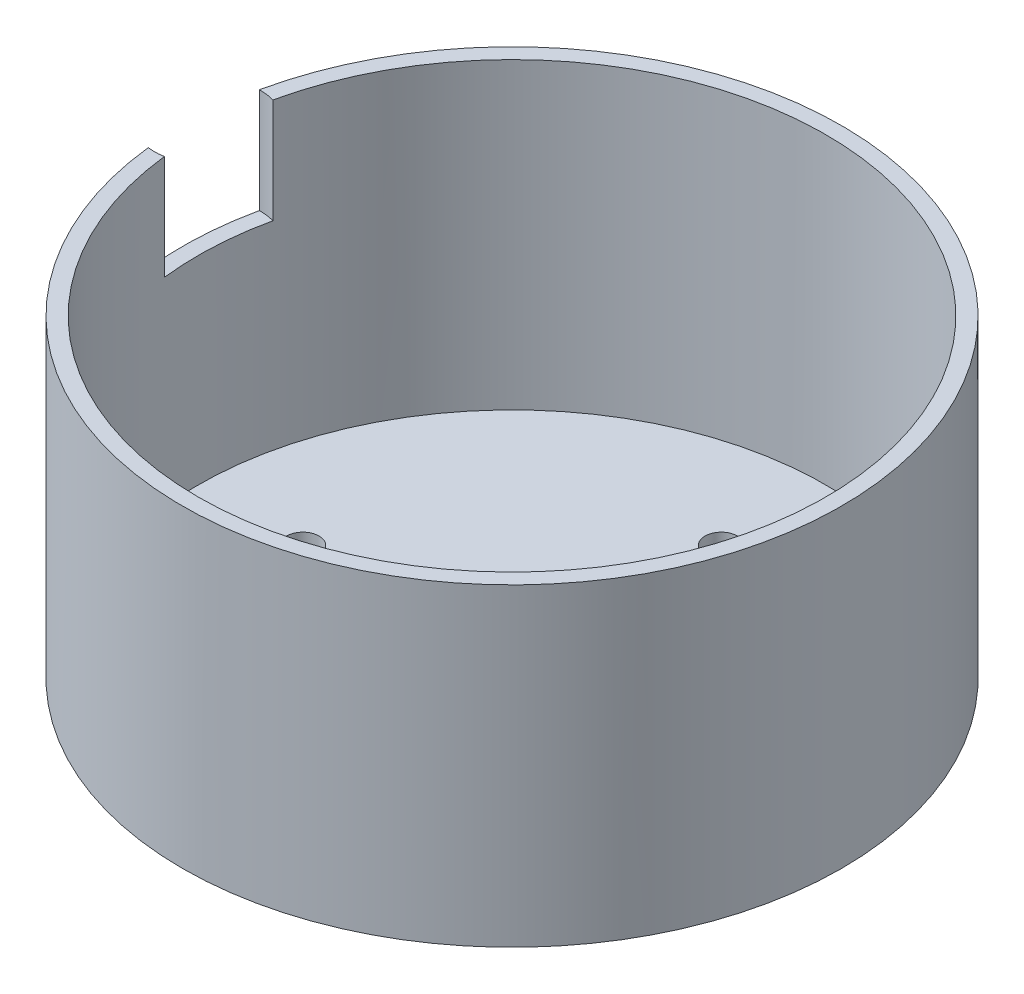
ISO-10303-21;
HEADER;
FILE_DESCRIPTION(('STEP AP214'),'2;1');
FILE_NAME('part.step','',(''),(''),'','','');
FILE_SCHEMA(('AUTOMOTIVE_DESIGN { 1 0 10303 214 1 1 1 1 }'));
ENDSEC;
DATA;
#1=APPLICATION_CONTEXT('core data for automotive mechanical design processes');
#2=APPLICATION_PROTOCOL_DEFINITION('international standard','automotive_design',2000,#1);
#3=PRODUCT_CONTEXT('',#1,'mechanical');
#4=PRODUCT('Part','Part','',(#3));
#5=PRODUCT_RELATED_PRODUCT_CATEGORY('part','',(#4));
#6=PRODUCT_DEFINITION_FORMATION('','',#4);
#7=PRODUCT_DEFINITION_CONTEXT('part definition',#1,'design');
#8=PRODUCT_DEFINITION('design','',#6,#7);
#9=PRODUCT_DEFINITION_SHAPE('','',#8);
#10=(LENGTH_UNIT() NAMED_UNIT(*) SI_UNIT(.MILLI.,.METRE.));
#11=(NAMED_UNIT(*) PLANE_ANGLE_UNIT() SI_UNIT($,.RADIAN.));
#12=(NAMED_UNIT(*) SI_UNIT($,.STERADIAN.) SOLID_ANGLE_UNIT());
#13=UNCERTAINTY_MEASURE_WITH_UNIT(LENGTH_MEASURE(1.E-05),#10,'distance_accuracy_value','');
#14=(GEOMETRIC_REPRESENTATION_CONTEXT(3) GLOBAL_UNCERTAINTY_ASSIGNED_CONTEXT((#13)) GLOBAL_UNIT_ASSIGNED_CONTEXT((#10,
#11,#12)) REPRESENTATION_CONTEXT('',''));
#15=CARTESIAN_POINT('',(0.,0.,0.));
#16=DIRECTION('',(0.,0.,1.));
#17=DIRECTION('',(1.,0.,0.));
#18=AXIS2_PLACEMENT_3D('',#15,#16,#17);
#19=CARTESIAN_POINT('',(0.,30.,0.));
#20=DIRECTION('',(0.,-1.,0.));
#21=DIRECTION('',(0.,0.,-1.));
#22=AXIS2_PLACEMENT_3D('',#19,#20,#21);
#23=CYLINDRICAL_SURFACE('',#22,31.5);
#24=CARTESIAN_POINT('',(0.,0.,0.));
#25=DIRECTION('',(0.,1.,0.));
#26=DIRECTION('',(0.,0.,1.));
#27=AXIS2_PLACEMENT_3D('',#24,#25,#26);
#28=CIRCLE('',#27,31.5);
#29=CARTESIAN_POINT('',(0.,0.,31.5));
#30=VERTEX_POINT('',#29);
#31=EDGE_CURVE('E95',#30,#30,#28,.T.);
#32=ORIENTED_EDGE('',*,*,#31,.T.);
#33=EDGE_LOOP('',(#32));
#34=FACE_BOUND('',#33,.T.);
#35=DIRECTION('',(0.,-1.,0.));
#36=VECTOR('',#35,1.);
#37=CARTESIAN_POINT('',(-30.7927132439752,25.,-6.63768115190193));
#38=LINE('',#37,#36);
#39=CARTESIAN_POINT('',(-30.7927132439752,30.,-6.63768115190193));
#40=VERTEX_POINT('',#39);
#41=CARTESIAN_POINT('',(-30.7927132439752,20.,-6.63768115190193));
#42=VERTEX_POINT('',#41);
#43=EDGE_CURVE('E118',#40,#42,#38,.T.);
#44=ORIENTED_EDGE('',*,*,#43,.F.);
#45=CARTESIAN_POINT('',(0.,30.,0.));
#46=DIRECTION('',(0.,1.,0.));
#47=DIRECTION('',(0.,0.,1.));
#48=AXIS2_PLACEMENT_3D('',#45,#46,#47);
#49=CIRCLE('',#48,31.5);
#50=CARTESIAN_POINT('',(-31.308347944542,30.,3.46948828842145));
#51=VERTEX_POINT('',#50);
#52=EDGE_CURVE('E102',#51,#40,#49,.T.);
#53=ORIENTED_EDGE('',*,*,#52,.F.);
#54=DIRECTION('',(0.,-1.,0.));
#55=VECTOR('',#54,1.);
#56=CARTESIAN_POINT('',(-31.308347944542,25.,3.46948828842145));
#57=LINE('',#56,#55);
#58=CARTESIAN_POINT('',(-31.308347944542,20.,3.46948828842145));
#59=VERTEX_POINT('',#58);
#60=EDGE_CURVE('E76',#59,#51,#57,.F.);
#61=ORIENTED_EDGE('',*,*,#60,.F.);
#62=CARTESIAN_POINT('',(0.,20.,0.));
#63=DIRECTION('',(0.,-1.,0.));
#64=DIRECTION('',(0.,0.,-1.));
#65=AXIS2_PLACEMENT_3D('',#62,#63,#64);
#66=CIRCLE('',#65,31.5);
#67=EDGE_CURVE('E54',#59,#42,#66,.T.);
#68=ORIENTED_EDGE('',*,*,#67,.T.);
#69=EDGE_LOOP('',(#44,#53,#61,#68));
#70=FACE_BOUND('',#69,.T.);
#71=ADVANCED_FACE('F33',(#34,#70),#23,.T.);
#72=CARTESIAN_POINT('',(0.,0.999999999999997,0.));
#73=DIRECTION('',(0.,1.,0.));
#74=DIRECTION('',(0.,0.,1.));
#75=AXIS2_PLACEMENT_3D('',#72,#73,#74);
#76=CYLINDRICAL_SURFACE('',#75,30.);
#77=CARTESIAN_POINT('',(0.,0.999999999999997,0.));
#78=DIRECTION('',(0.,1.,0.));
#79=DIRECTION('',(0.,0.,1.));
#80=AXIS2_PLACEMENT_3D('',#77,#78,#79);
#81=CIRCLE('',#80,30.);
#82=CARTESIAN_POINT('',(0.,0.999999999999997,30.));
#83=VERTEX_POINT('',#82);
#84=EDGE_CURVE('E91',#83,#83,#81,.T.);
#85=ORIENTED_EDGE('',*,*,#84,.F.);
#86=EDGE_LOOP('',(#85));
#87=FACE_BOUND('',#86,.T.);
#88=DIRECTION('',(0.,-1.,0.));
#89=VECTOR('',#88,1.);
#90=CARTESIAN_POINT('',(-29.8034670050977,25.,3.42831656590367));
#91=LINE('',#90,#89);
#92=CARTESIAN_POINT('',(-29.8034670050977,30.,3.42831656590367));
#93=VERTEX_POINT('',#92);
#94=CARTESIAN_POINT('',(-29.8034670050977,20.,3.42831656590367));
#95=VERTEX_POINT('',#94);
#96=EDGE_CURVE('E12',#93,#95,#91,.T.);
#97=ORIENTED_EDGE('',*,*,#96,.F.);
#98=CARTESIAN_POINT('',(0.,30.,0.));
#99=DIRECTION('',(0.,1.,0.));
#100=DIRECTION('',(0.,0.,1.));
#101=AXIS2_PLACEMENT_3D('',#98,#99,#100);
#102=CIRCLE('',#101,30.);
#103=CARTESIAN_POINT('',(-29.2998354833074,30.,-6.44357359321058));
#104=VERTEX_POINT('',#103);
#105=EDGE_CURVE('E88',#93,#104,#102,.T.);
#106=ORIENTED_EDGE('',*,*,#105,.T.);
#107=DIRECTION('',(0.,-1.,0.));
#108=VECTOR('',#107,1.);
#109=CARTESIAN_POINT('',(-29.2998354833074,25.,-6.44357359321058));
#110=LINE('',#109,#108);
#111=CARTESIAN_POINT('',(-29.2998354833074,20.,-6.44357359321058));
#112=VERTEX_POINT('',#111);
#113=EDGE_CURVE('E104',#112,#104,#110,.F.);
#114=ORIENTED_EDGE('',*,*,#113,.F.);
#115=CARTESIAN_POINT('',(0.,20.,0.));
#116=DIRECTION('',(0.,-1.,0.));
#117=DIRECTION('',(0.,0.,-1.));
#118=AXIS2_PLACEMENT_3D('',#115,#116,#117);
#119=CIRCLE('',#118,30.);
#120=EDGE_CURVE('E40',#112,#95,#119,.F.);
#121=ORIENTED_EDGE('',*,*,#120,.T.);
#122=EDGE_LOOP('',(#97,#106,#114,#121));
#123=FACE_BOUND('',#122,.T.);
#124=ADVANCED_FACE('F86',(#87,#123),#76,.F.);
#125=CARTESIAN_POINT('',(0.,30.,0.));
#126=DIRECTION('',(0.,1.,0.));
#127=DIRECTION('',(0.,0.,1.));
#128=AXIS2_PLACEMENT_3D('',#125,#126,#127);
#129=PLANE('',#128);
#130=ORIENTED_EDGE('',*,*,#52,.T.);
#131=CARTESIAN_POINT('',(-30.6931053583526,30.,-1.56586176618134));
#132=DIRECTION('',(0.,1.,0.));
#133=DIRECTION('',(0.,0.,1.));
#134=AXIS2_PLACEMENT_3D('',#131,#132,#133);
#135=CIRCLE('',#134,5.07279741486385);
#136=EDGE_CURVE('E81',#104,#40,#135,.T.);
#137=ORIENTED_EDGE('',*,*,#136,.F.);
#138=ORIENTED_EDGE('',*,*,#105,.F.);
#139=EDGE_CURVE('E72',#51,#93,#135,.T.);
#140=ORIENTED_EDGE('',*,*,#139,.F.);
#141=EDGE_LOOP('',(#130,#137,#138,#140));
#142=FACE_BOUND('',#141,.T.);
#143=ADVANCED_FACE('F90',(#142),#129,.T.);
#144=CARTESIAN_POINT('',(0.,0.,0.));
#145=DIRECTION('',(0.,1.,0.));
#146=DIRECTION('',(0.,0.,1.));
#147=AXIS2_PLACEMENT_3D('',#144,#145,#146);
#148=PLANE('',#147);
#149=CARTESIAN_POINT('',(0.,0.,20.));
#150=DIRECTION('',(0.,-1.,0.));
#151=DIRECTION('',(0.,0.,-1.));
#152=AXIS2_PLACEMENT_3D('',#149,#150,#151);
#153=CIRCLE('',#152,1.55);
#154=CARTESIAN_POINT('',(0.,0.,18.45));
#155=VERTEX_POINT('',#154);
#156=EDGE_CURVE('E111',#155,#155,#153,.T.);
#157=ORIENTED_EDGE('',*,*,#156,.F.);
#158=EDGE_LOOP('',(#157));
#159=FACE_BOUND('',#158,.T.);
#160=CARTESIAN_POINT('',(0.,0.,-20.));
#161=DIRECTION('',(0.,-1.,0.));
#162=DIRECTION('',(0.,0.,-1.));
#163=AXIS2_PLACEMENT_3D('',#160,#161,#162);
#164=CIRCLE('',#163,1.55);
#165=CARTESIAN_POINT('',(0.,0.,-21.55));
#166=VERTEX_POINT('',#165);
#167=EDGE_CURVE('E129',#166,#166,#164,.T.);
#168=ORIENTED_EDGE('',*,*,#167,.F.);
#169=EDGE_LOOP('',(#168));
#170=FACE_BOUND('',#169,.T.);
#171=CARTESIAN_POINT('',(-20.,0.,0.));
#172=DIRECTION('',(0.,-1.,0.));
#173=DIRECTION('',(0.,0.,-1.));
#174=AXIS2_PLACEMENT_3D('',#171,#172,#173);
#175=CIRCLE('',#174,1.55);
#176=CARTESIAN_POINT('',(-20.,0.,-1.55));
#177=VERTEX_POINT('',#176);
#178=EDGE_CURVE('E132',#177,#177,#175,.T.);
#179=ORIENTED_EDGE('',*,*,#178,.F.);
#180=EDGE_LOOP('',(#179));
#181=FACE_BOUND('',#180,.T.);
#182=CARTESIAN_POINT('',(20.,0.,0.));
#183=DIRECTION('',(0.,-1.,0.));
#184=DIRECTION('',(0.,0.,-1.));
#185=AXIS2_PLACEMENT_3D('',#182,#183,#184);
#186=CIRCLE('',#185,1.55);
#187=CARTESIAN_POINT('',(20.,0.,-1.55));
#188=VERTEX_POINT('',#187);
#189=EDGE_CURVE('E122',#188,#188,#186,.T.);
#190=ORIENTED_EDGE('',*,*,#189,.F.);
#191=EDGE_LOOP('',(#190));
#192=FACE_BOUND('',#191,.T.);
#193=ORIENTED_EDGE('',*,*,#31,.F.);
#194=EDGE_LOOP('',(#193));
#195=FACE_BOUND('',#194,.T.);
#196=ADVANCED_FACE('F139',(#159,#170,#181,#192,#195),#148,.F.);
#197=CARTESIAN_POINT('',(0.,0.999999999999997,0.));
#198=DIRECTION('',(0.,1.,0.));
#199=DIRECTION('',(0.,0.,1.));
#200=AXIS2_PLACEMENT_3D('',#197,#198,#199);
#201=PLANE('',#200);
#202=CARTESIAN_POINT('',(0.,0.999999999999997,20.));
#203=DIRECTION('',(0.,1.,0.));
#204=DIRECTION('',(0.,0.,1.));
#205=AXIS2_PLACEMENT_3D('',#202,#203,#204);
#206=CIRCLE('',#205,1.55);
#207=CARTESIAN_POINT('',(0.,0.999999999999997,21.55));
#208=VERTEX_POINT('',#207);
#209=EDGE_CURVE('E92',#208,#208,#206,.T.);
#210=ORIENTED_EDGE('',*,*,#209,.F.);
#211=EDGE_LOOP('',(#210));
#212=FACE_BOUND('',#211,.T.);
#213=CARTESIAN_POINT('',(0.,0.999999999999997,-20.));
#214=DIRECTION('',(0.,1.,0.));
#215=DIRECTION('',(0.,0.,1.));
#216=AXIS2_PLACEMENT_3D('',#213,#214,#215);
#217=CIRCLE('',#216,1.55);
#218=CARTESIAN_POINT('',(0.,0.999999999999997,-18.45));
#219=VERTEX_POINT('',#218);
#220=EDGE_CURVE('E98',#219,#219,#217,.T.);
#221=ORIENTED_EDGE('',*,*,#220,.F.);
#222=EDGE_LOOP('',(#221));
#223=FACE_BOUND('',#222,.T.);
#224=CARTESIAN_POINT('',(-20.,0.999999999999997,0.));
#225=DIRECTION('',(0.,1.,0.));
#226=DIRECTION('',(0.,0.,1.));
#227=AXIS2_PLACEMENT_3D('',#224,#225,#226);
#228=CIRCLE('',#227,1.55);
#229=CARTESIAN_POINT('',(-20.,0.999999999999997,1.55));
#230=VERTEX_POINT('',#229);
#231=EDGE_CURVE('E110',#230,#230,#228,.T.);
#232=ORIENTED_EDGE('',*,*,#231,.F.);
#233=EDGE_LOOP('',(#232));
#234=FACE_BOUND('',#233,.T.);
#235=CARTESIAN_POINT('',(20.,0.999999999999997,0.));
#236=DIRECTION('',(0.,1.,0.));
#237=DIRECTION('',(0.,0.,1.));
#238=AXIS2_PLACEMENT_3D('',#235,#236,#237);
#239=CIRCLE('',#238,1.55);
#240=CARTESIAN_POINT('',(20.,0.999999999999997,1.55));
#241=VERTEX_POINT('',#240);
#242=EDGE_CURVE('E107',#241,#241,#239,.T.);
#243=ORIENTED_EDGE('',*,*,#242,.F.);
#244=EDGE_LOOP('',(#243));
#245=FACE_BOUND('',#244,.T.);
#246=ORIENTED_EDGE('',*,*,#84,.T.);
#247=EDGE_LOOP('',(#246));
#248=FACE_BOUND('',#247,.T.);
#249=ADVANCED_FACE('F142',(#212,#223,#234,#245,#248),#201,.T.);
#250=CARTESIAN_POINT('',(20.,30.,0.));
#251=DIRECTION('',(0.,-1.,0.));
#252=DIRECTION('',(0.,0.,-1.));
#253=AXIS2_PLACEMENT_3D('',#250,#251,#252);
#254=CYLINDRICAL_SURFACE('',#253,1.55);
#255=ORIENTED_EDGE('',*,*,#242,.T.);
#256=EDGE_LOOP('',(#255));
#257=FACE_BOUND('',#256,.T.);
#258=ORIENTED_EDGE('',*,*,#189,.T.);
#259=EDGE_LOOP('',(#258));
#260=FACE_BOUND('',#259,.T.);
#261=ADVANCED_FACE('F137',(#257,#260),#254,.F.);
#262=CARTESIAN_POINT('',(-20.,30.,0.));
#263=DIRECTION('',(0.,-1.,0.));
#264=DIRECTION('',(0.,0.,-1.));
#265=AXIS2_PLACEMENT_3D('',#262,#263,#264);
#266=CYLINDRICAL_SURFACE('',#265,1.55);
#267=ORIENTED_EDGE('',*,*,#231,.T.);
#268=EDGE_LOOP('',(#267));
#269=FACE_BOUND('',#268,.T.);
#270=ORIENTED_EDGE('',*,*,#178,.T.);
#271=EDGE_LOOP('',(#270));
#272=FACE_BOUND('',#271,.T.);
#273=ADVANCED_FACE('F164',(#269,#272),#266,.F.);
#274=CARTESIAN_POINT('',(0.,30.,-20.));
#275=DIRECTION('',(0.,-1.,0.));
#276=DIRECTION('',(0.,0.,-1.));
#277=AXIS2_PLACEMENT_3D('',#274,#275,#276);
#278=CYLINDRICAL_SURFACE('',#277,1.55);
#279=ORIENTED_EDGE('',*,*,#220,.T.);
#280=EDGE_LOOP('',(#279));
#281=FACE_BOUND('',#280,.T.);
#282=ORIENTED_EDGE('',*,*,#167,.T.);
#283=EDGE_LOOP('',(#282));
#284=FACE_BOUND('',#283,.T.);
#285=ADVANCED_FACE('F168',(#281,#284),#278,.F.);
#286=CARTESIAN_POINT('',(0.,30.,20.));
#287=DIRECTION('',(0.,-1.,0.));
#288=DIRECTION('',(0.,0.,-1.));
#289=AXIS2_PLACEMENT_3D('',#286,#287,#288);
#290=CYLINDRICAL_SURFACE('',#289,1.55);
#291=ORIENTED_EDGE('',*,*,#209,.T.);
#292=EDGE_LOOP('',(#291));
#293=FACE_BOUND('',#292,.T.);
#294=ORIENTED_EDGE('',*,*,#156,.T.);
#295=EDGE_LOOP('',(#294));
#296=FACE_BOUND('',#295,.T.);
#297=ADVANCED_FACE('F172',(#293,#296),#290,.F.);
#298=CARTESIAN_POINT('',(0.,20.,0.));
#299=DIRECTION('',(0.,-1.,0.));
#300=DIRECTION('',(0.,0.,-1.));
#301=AXIS2_PLACEMENT_3D('',#298,#299,#300);
#302=PLANE('',#301);
#303=CARTESIAN_POINT('',(-30.6931053583526,20.,-1.56586176618134));
#304=DIRECTION('',(0.,1.,0.));
#305=DIRECTION('',(0.,0.,1.));
#306=AXIS2_PLACEMENT_3D('',#303,#304,#305);
#307=CIRCLE('',#306,5.07279741486385);
#308=EDGE_CURVE('E119',#59,#95,#307,.T.);
#309=ORIENTED_EDGE('',*,*,#308,.T.);
#310=ORIENTED_EDGE('',*,*,#120,.F.);
#311=EDGE_CURVE('E47',#112,#42,#307,.T.);
#312=ORIENTED_EDGE('',*,*,#311,.T.);
#313=ORIENTED_EDGE('',*,*,#67,.F.);
#314=EDGE_LOOP('',(#309,#310,#312,#313));
#315=FACE_BOUND('',#314,.T.);
#316=ADVANCED_FACE('F176',(#315),#302,.F.);
#317=CARTESIAN_POINT('',(-30.6931053583526,30.,-1.56586176618134));
#318=DIRECTION('',(0.,-1.,0.));
#319=DIRECTION('',(0.,0.,-1.));
#320=AXIS2_PLACEMENT_3D('',#317,#318,#319);
#321=CYLINDRICAL_SURFACE('',#320,5.07279741486385);
#322=ORIENTED_EDGE('',*,*,#43,.T.);
#323=ORIENTED_EDGE('',*,*,#311,.F.);
#324=ORIENTED_EDGE('',*,*,#113,.T.);
#325=ORIENTED_EDGE('',*,*,#136,.T.);
#326=EDGE_LOOP('',(#322,#323,#324,#325));
#327=FACE_BOUND('',#326,.T.);
#328=ADVANCED_FACE('F116',(#327),#321,.F.);
#329=ORIENTED_EDGE('',*,*,#60,.T.);
#330=ORIENTED_EDGE('',*,*,#139,.T.);
#331=ORIENTED_EDGE('',*,*,#96,.T.);
#332=ORIENTED_EDGE('',*,*,#308,.F.);
#333=EDGE_LOOP('',(#329,#330,#331,#332));
#334=FACE_BOUND('',#333,.T.);
#335=ADVANCED_FACE('F74',(#334),#321,.F.);
#336=CLOSED_SHELL('',(#71,#124,#143,#196,#249,#261,#273,#285,#297,#316,#328,#335));
#337=MANIFOLD_SOLID_BREP('B2',#336);
#338=ADVANCED_BREP_SHAPE_REPRESENTATION('',(#18,#337),#14);
#339=SHAPE_DEFINITION_REPRESENTATION(#9,#338);
ENDSEC;
END-ISO-10303-21;
